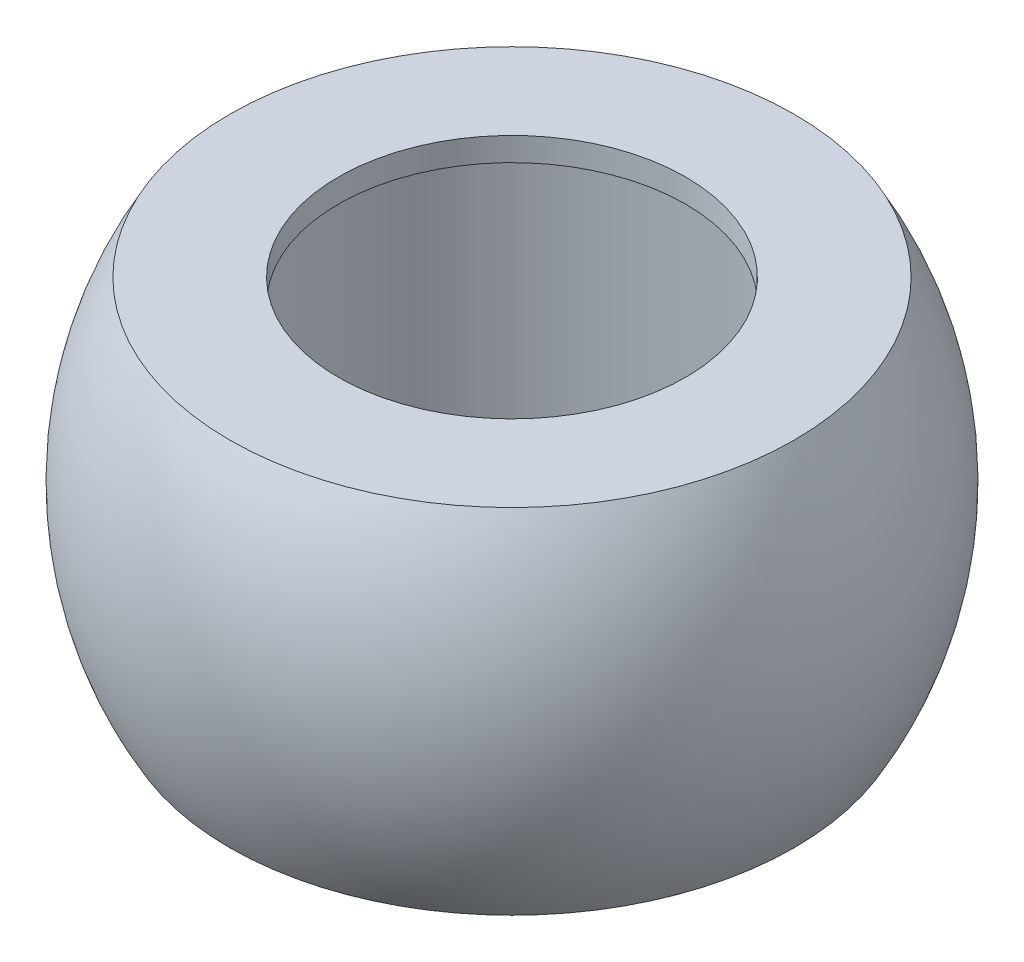
ISO-10303-21;
HEADER;
FILE_DESCRIPTION(('STEP AP214'),'2;1');
FILE_NAME('part.step','',(''),(''),'','','');
FILE_SCHEMA(('AUTOMOTIVE_DESIGN { 1 0 10303 214 1 1 1 1 }'));
ENDSEC;
DATA;
#1=APPLICATION_CONTEXT('core data for automotive mechanical design processes');
#2=APPLICATION_PROTOCOL_DEFINITION('international standard','automotive_design',2000,#1);
#3=PRODUCT_CONTEXT('',#1,'mechanical');
#4=PRODUCT('Part','Part','',(#3));
#5=PRODUCT_RELATED_PRODUCT_CATEGORY('part','',(#4));
#6=PRODUCT_DEFINITION_FORMATION('','',#4);
#7=PRODUCT_DEFINITION_CONTEXT('part definition',#1,'design');
#8=PRODUCT_DEFINITION('design','',#6,#7);
#9=PRODUCT_DEFINITION_SHAPE('','',#8);
#10=(LENGTH_UNIT() NAMED_UNIT(*) SI_UNIT(.MILLI.,.METRE.));
#11=(NAMED_UNIT(*) PLANE_ANGLE_UNIT() SI_UNIT($,.RADIAN.));
#12=(NAMED_UNIT(*) SI_UNIT($,.STERADIAN.) SOLID_ANGLE_UNIT());
#13=UNCERTAINTY_MEASURE_WITH_UNIT(LENGTH_MEASURE(1.E-05),#10,'distance_accuracy_value','');
#14=(GEOMETRIC_REPRESENTATION_CONTEXT(3) GLOBAL_UNCERTAINTY_ASSIGNED_CONTEXT((#13)) GLOBAL_UNIT_ASSIGNED_CONTEXT((#10,
#11,#12)) REPRESENTATION_CONTEXT('',''));
#15=CARTESIAN_POINT('',(0.,0.,0.));
#16=DIRECTION('',(0.,0.,1.));
#17=DIRECTION('',(1.,0.,0.));
#18=AXIS2_PLACEMENT_3D('',#15,#16,#17);
#19=CARTESIAN_POINT('',(0.,16.5,0.));
#20=DIRECTION('',(0.,-1.,0.));
#21=DIRECTION('',(0.,0.,-1.));
#22=AXIS2_PLACEMENT_3D('',#19,#20,#21);
#23=CYLINDRICAL_SURFACE('',#22,20.);
#24=CARTESIAN_POINT('',(0.,5.,0.));
#25=DIRECTION('',(0.,-1.,0.));
#26=DIRECTION('',(0.,0.,-1.));
#27=AXIS2_PLACEMENT_3D('',#24,#25,#26);
#28=CIRCLE('',#27,20.);
#29=CARTESIAN_POINT('',(0.,5.,-20.));
#30=VERTEX_POINT('',#29);
#31=EDGE_CURVE('E19',#30,#30,#28,.F.);
#32=ORIENTED_EDGE('',*,*,#31,.F.);
#33=EDGE_LOOP('',(#32));
#34=FACE_BOUND('',#33,.T.);
#35=CARTESIAN_POINT('',(0.,28.,0.));
#36=DIRECTION('',(0.,-1.,0.));
#37=DIRECTION('',(0.,0.,-1.));
#38=AXIS2_PLACEMENT_3D('',#35,#36,#37);
#39=CIRCLE('',#38,20.);
#40=CARTESIAN_POINT('',(0.,28.,-20.));
#41=VERTEX_POINT('',#40);
#42=EDGE_CURVE('E41',#41,#41,#39,.T.);
#43=ORIENTED_EDGE('',*,*,#42,.F.);
#44=EDGE_LOOP('',(#43));
#45=FACE_BOUND('',#44,.T.);
#46=ADVANCED_FACE('F15',(#34,#45),#23,.F.);
#47=CARTESIAN_POINT('',(18.875,5.,0.));
#48=DIRECTION('',(0.,1.,0.));
#49=DIRECTION('',(0.,0.,1.));
#50=AXIS2_PLACEMENT_3D('',#47,#48,#49);
#51=PLANE('',#50);
#52=CARTESIAN_POINT('',(0.,5.,0.));
#53=DIRECTION('',(0.,-1.,0.));
#54=DIRECTION('',(0.,0.,-1.));
#55=AXIS2_PLACEMENT_3D('',#52,#53,#54);
#56=CIRCLE('',#55,17.75);
#57=CARTESIAN_POINT('',(0.,5.,-17.75));
#58=VERTEX_POINT('',#57);
#59=EDGE_CURVE('E39',#58,#58,#56,.T.);
#60=ORIENTED_EDGE('',*,*,#59,.T.);
#61=EDGE_LOOP('',(#60));
#62=FACE_BOUND('',#61,.T.);
#63=ORIENTED_EDGE('',*,*,#31,.T.);
#64=EDGE_LOOP('',(#63));
#65=FACE_BOUND('',#64,.T.);
#66=ADVANCED_FACE('F48',(#62,#65),#51,.T.);
#67=CARTESIAN_POINT('',(17.375,28.,0.));
#68=DIRECTION('',(0.,-1.,0.));
#69=DIRECTION('',(0.,0.,-1.));
#70=AXIS2_PLACEMENT_3D('',#67,#68,#69);
#71=PLANE('',#70);
#72=CARTESIAN_POINT('',(0.,28.,0.));
#73=DIRECTION('',(0.,-1.,0.));
#74=DIRECTION('',(0.,0.,-1.));
#75=AXIS2_PLACEMENT_3D('',#72,#73,#74);
#76=CIRCLE('',#75,14.75);
#77=CARTESIAN_POINT('',(0.,28.,-14.75));
#78=VERTEX_POINT('',#77);
#79=EDGE_CURVE('E36',#78,#78,#76,.F.);
#80=ORIENTED_EDGE('',*,*,#79,.T.);
#81=EDGE_LOOP('',(#80));
#82=FACE_BOUND('',#81,.T.);
#83=ORIENTED_EDGE('',*,*,#42,.T.);
#84=EDGE_LOOP('',(#83));
#85=FACE_BOUND('',#84,.T.);
#86=ADVANCED_FACE('F56',(#82,#85),#71,.T.);
#87=CARTESIAN_POINT('',(0.,2.5,0.));
#88=DIRECTION('',(0.,-1.,0.));
#89=DIRECTION('',(0.,0.,-1.));
#90=AXIS2_PLACEMENT_3D('',#87,#88,#89);
#91=CYLINDRICAL_SURFACE('',#90,17.75);
#92=CARTESIAN_POINT('',(0.,0.,0.));
#93=DIRECTION('',(0.,-1.,0.));
#94=DIRECTION('',(0.,0.,-1.));
#95=AXIS2_PLACEMENT_3D('',#92,#93,#94);
#96=CIRCLE('',#95,17.75);
#97=CARTESIAN_POINT('',(0.,0.,-17.75));
#98=VERTEX_POINT('',#97);
#99=EDGE_CURVE('E33',#98,#98,#96,.F.);
#100=ORIENTED_EDGE('',*,*,#99,.F.);
#101=EDGE_LOOP('',(#100));
#102=FACE_BOUND('',#101,.T.);
#103=ORIENTED_EDGE('',*,*,#59,.F.);
#104=EDGE_LOOP('',(#103));
#105=FACE_BOUND('',#104,.T.);
#106=ADVANCED_FACE('F77',(#102,#105),#91,.F.);
#107=CARTESIAN_POINT('',(0.,29.,0.));
#108=DIRECTION('',(0.,-1.,0.));
#109=DIRECTION('',(0.,0.,-1.));
#110=AXIS2_PLACEMENT_3D('',#107,#108,#109);
#111=CYLINDRICAL_SURFACE('',#110,14.75);
#112=ORIENTED_EDGE('',*,*,#79,.F.);
#113=EDGE_LOOP('',(#112));
#114=FACE_BOUND('',#113,.T.);
#115=CARTESIAN_POINT('',(0.,30.,0.));
#116=DIRECTION('',(0.,-1.,0.));
#117=DIRECTION('',(0.,0.,-1.));
#118=AXIS2_PLACEMENT_3D('',#115,#116,#117);
#119=CIRCLE('',#118,14.75);
#120=CARTESIAN_POINT('',(0.,30.,-14.75));
#121=VERTEX_POINT('',#120);
#122=EDGE_CURVE('E28',#121,#121,#119,.T.);
#123=ORIENTED_EDGE('',*,*,#122,.F.);
#124=EDGE_LOOP('',(#123));
#125=FACE_BOUND('',#124,.T.);
#126=ADVANCED_FACE('F71',(#114,#125),#111,.F.);
#127=CARTESIAN_POINT('',(20.8653810567666,0.,0.));
#128=DIRECTION('',(0.,-1.,0.));
#129=DIRECTION('',(0.,0.,-1.));
#130=AXIS2_PLACEMENT_3D('',#127,#128,#129);
#131=PLANE('',#130);
#132=ORIENTED_EDGE('',*,*,#99,.T.);
#133=EDGE_LOOP('',(#132));
#134=FACE_BOUND('',#133,.T.);
#135=CARTESIAN_POINT('',(0.,0.,0.));
#136=DIRECTION('',(0.,1.,0.));
#137=DIRECTION('',(0.,0.,1.));
#138=AXIS2_PLACEMENT_3D('',#135,#136,#137);
#139=CIRCLE('',#138,23.9807621135332);
#140=CARTESIAN_POINT('',(0.,0.,23.9807621135332));
#141=VERTEX_POINT('',#140);
#142=EDGE_CURVE('E23',#141,#141,#139,.T.);
#143=ORIENTED_EDGE('',*,*,#142,.F.);
#144=EDGE_LOOP('',(#143));
#145=FACE_BOUND('',#144,.T.);
#146=ADVANCED_FACE('F64',(#134,#145),#131,.T.);
#147=CARTESIAN_POINT('',(19.3653810567666,30.,0.));
#148=DIRECTION('',(0.,1.,0.));
#149=DIRECTION('',(0.,0.,1.));
#150=AXIS2_PLACEMENT_3D('',#147,#148,#149);
#151=PLANE('',#150);
#152=ORIENTED_EDGE('',*,*,#122,.T.);
#153=EDGE_LOOP('',(#152));
#154=FACE_BOUND('',#153,.T.);
#155=CARTESIAN_POINT('',(0.,30.,0.));
#156=DIRECTION('',(0.,1.,0.));
#157=DIRECTION('',(0.,0.,1.));
#158=AXIS2_PLACEMENT_3D('',#155,#156,#157);
#159=CIRCLE('',#158,23.9807621135332);
#160=CARTESIAN_POINT('',(0.,30.,23.9807621135331));
#161=VERTEX_POINT('',#160);
#162=EDGE_CURVE('E10',#161,#161,#159,.F.);
#163=ORIENTED_EDGE('',*,*,#162,.F.);
#164=EDGE_LOOP('',(#163));
#165=FACE_BOUND('',#164,.T.);
#166=ADVANCED_FACE('F60',(#154,#165),#151,.T.);
#167=CARTESIAN_POINT('',(0.,15.,0.));
#168=DIRECTION('',(0.,1.,0.));
#169=DIRECTION('',(0.,0.,1.));
#170=AXIS2_PLACEMENT_3D('',#167,#168,#169);
#171=DEGENERATE_TOROIDAL_SURFACE('',#170,2.00000000000002,30.,.F.);
#172=ORIENTED_EDGE('',*,*,#162,.T.);
#173=EDGE_LOOP('',(#172));
#174=FACE_BOUND('',#173,.T.);
#175=ORIENTED_EDGE('',*,*,#142,.T.);
#176=EDGE_LOOP('',(#175));
#177=FACE_BOUND('',#176,.T.);
#178=ADVANCED_FACE('F17',(#174,#177),#171,.F.);
#179=CLOSED_SHELL('',(#46,#66,#86,#106,#126,#146,#166,#178));
#180=MANIFOLD_SOLID_BREP('B1',#179);
#181=ADVANCED_BREP_SHAPE_REPRESENTATION('',(#18,#180),#14);
#182=SHAPE_DEFINITION_REPRESENTATION(#9,#181);
ENDSEC;
END-ISO-10303-21;
